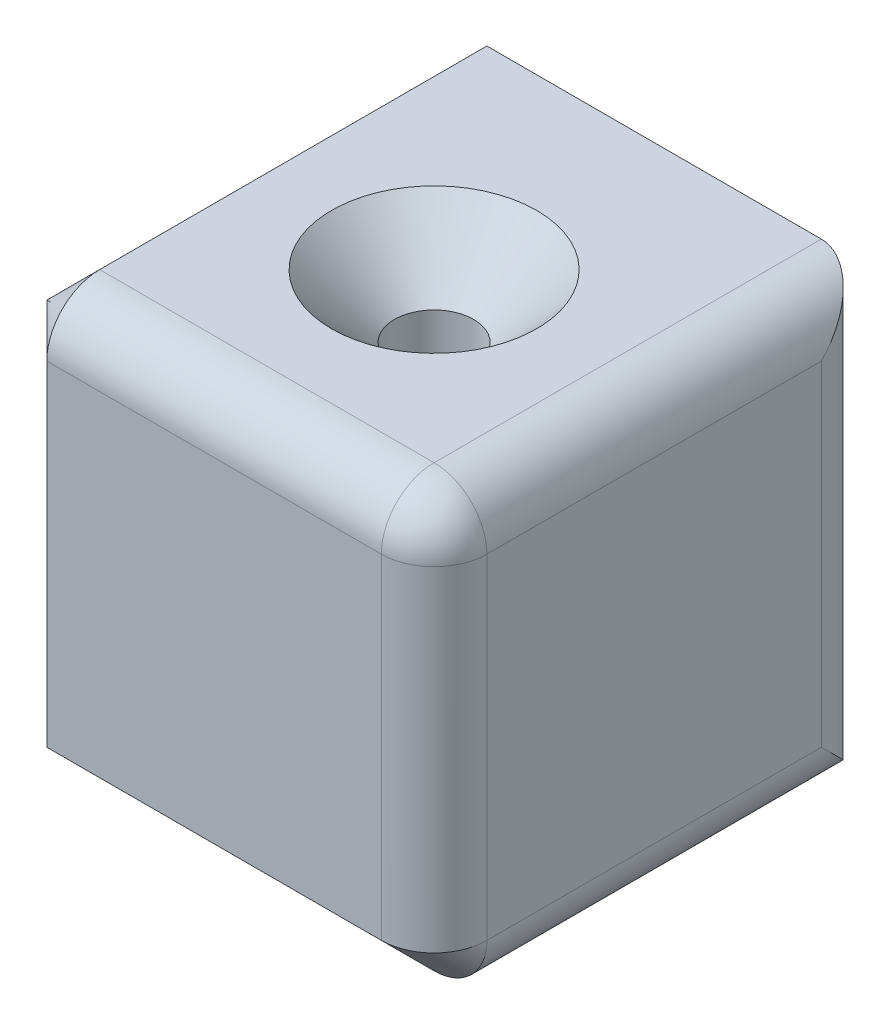
ISO-10303-21;
HEADER;
FILE_DESCRIPTION(('STEP AP214'),'2;1');
FILE_NAME('part.step','',(''),(''),'','','');
FILE_SCHEMA(('AUTOMOTIVE_DESIGN { 1 0 10303 214 1 1 1 1 }'));
ENDSEC;
DATA;
#1=APPLICATION_CONTEXT('core data for automotive mechanical design processes');
#2=APPLICATION_PROTOCOL_DEFINITION('international standard','automotive_design',2000,#1);
#3=PRODUCT_CONTEXT('',#1,'mechanical');
#4=PRODUCT('Part','Part','',(#3));
#5=PRODUCT_RELATED_PRODUCT_CATEGORY('part','',(#4));
#6=PRODUCT_DEFINITION_FORMATION('','',#4);
#7=PRODUCT_DEFINITION_CONTEXT('part definition',#1,'design');
#8=PRODUCT_DEFINITION('design','',#6,#7);
#9=PRODUCT_DEFINITION_SHAPE('','',#8);
#10=(LENGTH_UNIT() NAMED_UNIT(*) SI_UNIT(.MILLI.,.METRE.));
#11=(NAMED_UNIT(*) PLANE_ANGLE_UNIT() SI_UNIT($,.RADIAN.));
#12=(NAMED_UNIT(*) SI_UNIT($,.STERADIAN.) SOLID_ANGLE_UNIT());
#13=UNCERTAINTY_MEASURE_WITH_UNIT(LENGTH_MEASURE(1.E-05),#10,'distance_accuracy_value','');
#14=(GEOMETRIC_REPRESENTATION_CONTEXT(3) GLOBAL_UNCERTAINTY_ASSIGNED_CONTEXT((#13)) GLOBAL_UNIT_ASSIGNED_CONTEXT((#10,
#11,#12)) REPRESENTATION_CONTEXT('',''));
#15=CARTESIAN_POINT('',(0.,0.,0.));
#16=DIRECTION('',(0.,0.,1.));
#17=DIRECTION('',(1.,0.,0.));
#18=AXIS2_PLACEMENT_3D('',#15,#16,#17);
#19=CARTESIAN_POINT('',(0.,0.,25.));
#20=DIRECTION('',(1.,0.,0.));
#21=DIRECTION('',(0.,0.,-1.));
#22=AXIS2_PLACEMENT_3D('',#19,#20,#21);
#23=PLANE('',#22);
#24=DIRECTION('',(0.,1.,0.));
#25=VECTOR('',#24,1.);
#26=CARTESIAN_POINT('',(0.,0.,22.));
#27=LINE('',#26,#25);
#28=CARTESIAN_POINT('',(0.,0.,22.));
#29=VERTEX_POINT('',#28);
#30=CARTESIAN_POINT('',(0.,22.,22.));
#31=VERTEX_POINT('',#30);
#32=EDGE_CURVE('E306',#29,#31,#27,.T.);
#33=ORIENTED_EDGE('',*,*,#32,.T.);
#34=DIRECTION('',(0.,0.,-1.));
#35=VECTOR('',#34,1.);
#36=CARTESIAN_POINT('',(0.,22.,25.));
#37=LINE('',#36,#35);
#38=CARTESIAN_POINT('',(0.,22.,0.));
#39=VERTEX_POINT('',#38);
#40=EDGE_CURVE('E138',#31,#39,#37,.T.);
#41=ORIENTED_EDGE('',*,*,#40,.T.);
#42=DIRECTION('',(0.,-1.,0.));
#43=VECTOR('',#42,1.);
#44=CARTESIAN_POINT('',(0.,0.,0.));
#45=LINE('',#44,#43);
#46=CARTESIAN_POINT('',(0.,0.,0.));
#47=VERTEX_POINT('',#46);
#48=EDGE_CURVE('E136',#39,#47,#45,.T.);
#49=ORIENTED_EDGE('',*,*,#48,.T.);
#50=DIRECTION('',(0.,0.,-1.));
#51=VECTOR('',#50,1.);
#52=CARTESIAN_POINT('',(0.,0.,25.));
#53=LINE('',#52,#51);
#54=EDGE_CURVE('E120',#29,#47,#53,.T.);
#55=ORIENTED_EDGE('',*,*,#54,.F.);
#56=EDGE_LOOP('',(#33,#41,#49,#55));
#57=FACE_BOUND('',#56,.T.);
#58=ADVANCED_FACE('F46',(#57),#23,.F.);
#59=CARTESIAN_POINT('',(0.,0.,25.));
#60=DIRECTION('',(0.,1.,0.));
#61=DIRECTION('',(0.,0.,1.));
#62=AXIS2_PLACEMENT_3D('',#59,#60,#61);
#63=PLANE('',#62);
#64=CARTESIAN_POINT('',(12.5,0.,12.5));
#65=DIRECTION('',(0.,1.,0.));
#66=DIRECTION('',(0.,0.,1.));
#67=AXIS2_PLACEMENT_3D('',#64,#65,#66);
#68=CIRCLE('',#67,2.25);
#69=CARTESIAN_POINT('',(12.5,0.,14.75));
#70=VERTEX_POINT('',#69);
#71=EDGE_CURVE('E313',#70,#70,#68,.T.);
#72=ORIENTED_EDGE('',*,*,#71,.T.);
#73=EDGE_LOOP('',(#72));
#74=FACE_BOUND('',#73,.T.);
#75=DIRECTION('',(0.,0.,-1.));
#76=VECTOR('',#75,1.);
#77=CARTESIAN_POINT('',(22.,0.,25.));
#78=LINE('',#77,#76);
#79=CARTESIAN_POINT('',(22.,0.,0.));
#80=VERTEX_POINT('',#79);
#81=CARTESIAN_POINT('',(22.,0.,22.));
#82=VERTEX_POINT('',#81);
#83=EDGE_CURVE('E165',#80,#82,#78,.F.);
#84=ORIENTED_EDGE('',*,*,#83,.T.);
#85=DIRECTION('',(-1.,0.,0.));
#86=VECTOR('',#85,1.);
#87=CARTESIAN_POINT('',(0.,0.,22.));
#88=LINE('',#87,#86);
#89=EDGE_CURVE('E11',#82,#29,#88,.T.);
#90=ORIENTED_EDGE('',*,*,#89,.T.);
#91=ORIENTED_EDGE('',*,*,#54,.T.);
#92=DIRECTION('',(1.,0.,0.));
#93=VECTOR('',#92,1.);
#94=CARTESIAN_POINT('',(0.,0.,0.));
#95=LINE('',#94,#93);
#96=EDGE_CURVE('E125',#47,#80,#95,.T.);
#97=ORIENTED_EDGE('',*,*,#96,.T.);
#98=EDGE_LOOP('',(#84,#90,#91,#97));
#99=FACE_BOUND('',#98,.T.);
#100=ADVANCED_FACE('F123',(#74,#99),#63,.F.);
#101=CARTESIAN_POINT('',(25.,0.,25.));
#102=DIRECTION('',(-1.,0.,0.));
#103=DIRECTION('',(0.,0.,1.));
#104=AXIS2_PLACEMENT_3D('',#101,#102,#103);
#105=PLANE('',#104);
#106=DIRECTION('',(0.,1.,0.));
#107=VECTOR('',#106,1.);
#108=CARTESIAN_POINT('',(25.,0.,22.));
#109=LINE('',#108,#107);
#110=CARTESIAN_POINT('',(25.,22.,22.));
#111=VERTEX_POINT('',#110);
#112=CARTESIAN_POINT('',(25.,3.,22.));
#113=VERTEX_POINT('',#112);
#114=EDGE_CURVE('E159',#111,#113,#109,.F.);
#115=ORIENTED_EDGE('',*,*,#114,.T.);
#116=DIRECTION('',(0.,0.,-1.));
#117=VECTOR('',#116,1.);
#118=CARTESIAN_POINT('',(25.,3.,25.));
#119=LINE('',#118,#117);
#120=CARTESIAN_POINT('',(25.,3.,3.));
#121=VERTEX_POINT('',#120);
#122=EDGE_CURVE('E169',#113,#121,#119,.T.);
#123=ORIENTED_EDGE('',*,*,#122,.T.);
#124=DIRECTION('',(0.,1.,0.));
#125=VECTOR('',#124,1.);
#126=CARTESIAN_POINT('',(25.,25.,3.));
#127=LINE('',#126,#125);
#128=CARTESIAN_POINT('',(25.,22.,3.));
#129=VERTEX_POINT('',#128);
#130=EDGE_CURVE('E131',#121,#129,#127,.T.);
#131=ORIENTED_EDGE('',*,*,#130,.T.);
#132=DIRECTION('',(0.,0.,-1.));
#133=VECTOR('',#132,1.);
#134=CARTESIAN_POINT('',(25.,22.,25.));
#135=LINE('',#134,#133);
#136=EDGE_CURVE('E156',#129,#111,#135,.F.);
#137=ORIENTED_EDGE('',*,*,#136,.T.);
#138=EDGE_LOOP('',(#115,#123,#131,#137));
#139=FACE_BOUND('',#138,.T.);
#140=ADVANCED_FACE('F347',(#139),#105,.F.);
#141=CARTESIAN_POINT('',(0.,25.,25.));
#142=DIRECTION('',(0.,-1.,0.));
#143=DIRECTION('',(0.,0.,-1.));
#144=AXIS2_PLACEMENT_3D('',#141,#142,#143);
#145=PLANE('',#144);
#146=CARTESIAN_POINT('',(12.5,25.,12.5));
#147=DIRECTION('',(0.,1.,0.));
#148=DIRECTION('',(0.,0.,1.));
#149=AXIS2_PLACEMENT_3D('',#146,#147,#148);
#150=CIRCLE('',#149,5.82633873679264);
#151=CARTESIAN_POINT('',(12.5,25.,18.3263387367926));
#152=VERTEX_POINT('',#151);
#153=EDGE_CURVE('E141',#152,#152,#150,.T.);
#154=ORIENTED_EDGE('',*,*,#153,.F.);
#155=EDGE_LOOP('',(#154));
#156=FACE_BOUND('',#155,.T.);
#157=DIRECTION('',(-1.,0.,0.));
#158=VECTOR('',#157,1.);
#159=CARTESIAN_POINT('',(0.,25.,0.));
#160=LINE('',#159,#158);
#161=CARTESIAN_POINT('',(22.,25.,0.));
#162=VERTEX_POINT('',#161);
#163=CARTESIAN_POINT('',(3.00000000000001,25.,0.));
#164=VERTEX_POINT('',#163);
#165=EDGE_CURVE('E132',#162,#164,#160,.T.);
#166=ORIENTED_EDGE('',*,*,#165,.T.);
#167=DIRECTION('',(0.,0.,1.));
#168=VECTOR('',#167,1.);
#169=CARTESIAN_POINT('',(3.00000000000001,25.,25.));
#170=LINE('',#169,#168);
#171=CARTESIAN_POINT('',(3.00000000000001,25.,22.));
#172=VERTEX_POINT('',#171);
#173=EDGE_CURVE('E292',#164,#172,#170,.T.);
#174=ORIENTED_EDGE('',*,*,#173,.T.);
#175=DIRECTION('',(-1.,0.,0.));
#176=VECTOR('',#175,1.);
#177=CARTESIAN_POINT('',(0.,25.,22.));
#178=LINE('',#177,#176);
#179=CARTESIAN_POINT('',(22.,25.,22.));
#180=VERTEX_POINT('',#179);
#181=EDGE_CURVE('E334',#172,#180,#178,.F.);
#182=ORIENTED_EDGE('',*,*,#181,.T.);
#183=DIRECTION('',(0.,0.,-1.));
#184=VECTOR('',#183,1.);
#185=CARTESIAN_POINT('',(22.,25.,25.));
#186=LINE('',#185,#184);
#187=EDGE_CURVE('E331',#180,#162,#186,.T.);
#188=ORIENTED_EDGE('',*,*,#187,.T.);
#189=EDGE_LOOP('',(#166,#174,#182,#188));
#190=FACE_BOUND('',#189,.T.);
#191=ADVANCED_FACE('F368',(#156,#190),#145,.F.);
#192=CARTESIAN_POINT('',(0.,0.,25.));
#193=DIRECTION('',(0.,0.,-1.));
#194=DIRECTION('',(-1.,0.,0.));
#195=AXIS2_PLACEMENT_3D('',#192,#193,#194);
#196=PLANE('',#195);
#197=DIRECTION('',(-1.,0.,0.));
#198=VECTOR('',#197,1.);
#199=CARTESIAN_POINT('',(0.,22.,25.));
#200=LINE('',#199,#198);
#201=CARTESIAN_POINT('',(22.,22.,25.));
#202=VERTEX_POINT('',#201);
#203=CARTESIAN_POINT('',(3.00000000000001,22.,25.));
#204=VERTEX_POINT('',#203);
#205=EDGE_CURVE('E162',#202,#204,#200,.T.);
#206=ORIENTED_EDGE('',*,*,#205,.T.);
#207=DIRECTION('',(0.,-1.,0.));
#208=VECTOR('',#207,1.);
#209=CARTESIAN_POINT('',(3.00000000000001,0.,25.));
#210=LINE('',#209,#208);
#211=CARTESIAN_POINT('',(3.00000000000001,3.00000000000001,25.));
#212=VERTEX_POINT('',#211);
#213=EDGE_CURVE('E59',#204,#212,#210,.T.);
#214=ORIENTED_EDGE('',*,*,#213,.T.);
#215=DIRECTION('',(1.,0.,0.));
#216=VECTOR('',#215,1.);
#217=CARTESIAN_POINT('',(0.,3.00000000000001,25.));
#218=LINE('',#217,#216);
#219=CARTESIAN_POINT('',(22.,3.00000000000001,25.));
#220=VERTEX_POINT('',#219);
#221=EDGE_CURVE('E70',#212,#220,#218,.T.);
#222=ORIENTED_EDGE('',*,*,#221,.T.);
#223=DIRECTION('',(0.,1.,0.));
#224=VECTOR('',#223,1.);
#225=CARTESIAN_POINT('',(22.,0.,25.));
#226=LINE('',#225,#224);
#227=EDGE_CURVE('E336',#220,#202,#226,.T.);
#228=ORIENTED_EDGE('',*,*,#227,.T.);
#229=EDGE_LOOP('',(#206,#214,#222,#228));
#230=FACE_BOUND('',#229,.T.);
#231=ADVANCED_FACE('F359',(#230),#196,.F.);
#232=CARTESIAN_POINT('',(0.,0.,0.));
#233=DIRECTION('',(0.,0.,-1.));
#234=DIRECTION('',(-1.,0.,0.));
#235=AXIS2_PLACEMENT_3D('',#232,#233,#234);
#236=PLANE('',#235);
#237=ORIENTED_EDGE('',*,*,#48,.F.);
#238=DIRECTION('',(-0.707106781186548,-0.707106781186548,0.));
#239=VECTOR('',#238,1.);
#240=CARTESIAN_POINT('',(-11.,11.,0.));
#241=LINE('',#240,#239);
#242=EDGE_CURVE('E298',#39,#164,#241,.F.);
#243=ORIENTED_EDGE('',*,*,#242,.T.);
#244=ORIENTED_EDGE('',*,*,#165,.F.);
#245=DIRECTION('',(0.,1.,0.));
#246=VECTOR('',#245,1.);
#247=CARTESIAN_POINT('',(22.,0.,0.));
#248=LINE('',#247,#246);
#249=EDGE_CURVE('E146',#162,#80,#248,.F.);
#250=ORIENTED_EDGE('',*,*,#249,.T.);
#251=ORIENTED_EDGE('',*,*,#96,.F.);
#252=EDGE_LOOP('',(#237,#243,#244,#250,#251));
#253=FACE_BOUND('',#252,.T.);
#254=ADVANCED_FACE('F143',(#253),#236,.T.);
#255=CARTESIAN_POINT('',(12.5,25.,12.5));
#256=DIRECTION('',(0.,1.,0.));
#257=DIRECTION('',(0.,0.,1.));
#258=AXIS2_PLACEMENT_3D('',#255,#256,#257);
#259=CONICAL_SURFACE('',#258,5.82633873679264,0.785398163397443);
#260=CARTESIAN_POINT('',(12.5,21.4236612632073,12.5));
#261=DIRECTION('',(0.,1.,0.));
#262=DIRECTION('',(0.,0.,1.));
#263=AXIS2_PLACEMENT_3D('',#260,#261,#262);
#264=CIRCLE('',#263,2.25);
#265=CARTESIAN_POINT('',(12.5,21.4236612632073,14.75));
#266=VERTEX_POINT('',#265);
#267=EDGE_CURVE('E392',#266,#266,#264,.T.);
#268=ORIENTED_EDGE('',*,*,#267,.F.);
#269=EDGE_LOOP('',(#268));
#270=FACE_BOUND('',#269,.T.);
#271=ORIENTED_EDGE('',*,*,#153,.T.);
#272=EDGE_LOOP('',(#271));
#273=FACE_BOUND('',#272,.T.);
#274=ADVANCED_FACE('F400',(#270,#273),#259,.F.);
#275=CARTESIAN_POINT('',(12.5,25.,12.5));
#276=DIRECTION('',(0.,1.,0.));
#277=DIRECTION('',(0.,0.,1.));
#278=AXIS2_PLACEMENT_3D('',#275,#276,#277);
#279=CYLINDRICAL_SURFACE('',#278,2.25);
#280=ORIENTED_EDGE('',*,*,#71,.F.);
#281=EDGE_LOOP('',(#280));
#282=FACE_BOUND('',#281,.T.);
#283=ORIENTED_EDGE('',*,*,#267,.T.);
#284=EDGE_LOOP('',(#283));
#285=FACE_BOUND('',#284,.T.);
#286=ADVANCED_FACE('F402',(#282,#285),#279,.F.);
#287=CARTESIAN_POINT('',(0.,22.,22.));
#288=DIRECTION('',(-1.,0.,0.));
#289=DIRECTION('',(0.,0.,1.));
#290=AXIS2_PLACEMENT_3D('',#287,#288,#289);
#291=CYLINDRICAL_SURFACE('',#290,3.);
#292=ORIENTED_EDGE('',*,*,#181,.F.);
#293=CARTESIAN_POINT('',(3.00000000000001,22.,22.));
#294=DIRECTION('',(1.,0.,0.));
#295=DIRECTION('',(0.,0.,-1.));
#296=AXIS2_PLACEMENT_3D('',#293,#294,#295);
#297=CIRCLE('',#296,3.);
#298=EDGE_CURVE('E170',#172,#204,#297,.T.);
#299=ORIENTED_EDGE('',*,*,#298,.T.);
#300=ORIENTED_EDGE('',*,*,#205,.F.);
#301=CARTESIAN_POINT('',(22.,22.,22.));
#302=DIRECTION('',(1.,0.,0.));
#303=DIRECTION('',(0.,0.,-1.));
#304=AXIS2_PLACEMENT_3D('',#301,#302,#303);
#305=CIRCLE('',#304,3.);
#306=EDGE_CURVE('E309',#180,#202,#305,.T.);
#307=ORIENTED_EDGE('',*,*,#306,.F.);
#308=EDGE_LOOP('',(#292,#299,#300,#307));
#309=FACE_BOUND('',#308,.T.);
#310=ADVANCED_FACE('F360',(#309),#291,.T.);
#311=CARTESIAN_POINT('',(22.,22.,22.));
#312=DIRECTION('',(0.,1.,0.));
#313=DIRECTION('',(0.,0.,1.));
#314=AXIS2_PLACEMENT_3D('',#311,#312,#313);
#315=SPHERICAL_SURFACE('',#314,3.);
#316=CARTESIAN_POINT('',(22.,22.,22.));
#317=DIRECTION('',(0.,1.,0.));
#318=DIRECTION('',(0.,0.,1.));
#319=AXIS2_PLACEMENT_3D('',#316,#317,#318);
#320=CIRCLE('',#319,3.);
#321=EDGE_CURVE('E318',#111,#202,#320,.F.);
#322=ORIENTED_EDGE('',*,*,#321,.F.);
#323=CARTESIAN_POINT('',(22.,22.,22.));
#324=DIRECTION('',(0.,0.,1.));
#325=DIRECTION('',(1.,0.,0.));
#326=AXIS2_PLACEMENT_3D('',#323,#324,#325);
#327=CIRCLE('',#326,3.);
#328=EDGE_CURVE('E314',#180,#111,#327,.F.);
#329=ORIENTED_EDGE('',*,*,#328,.F.);
#330=ORIENTED_EDGE('',*,*,#306,.T.);
#331=EDGE_LOOP('',(#322,#329,#330));
#332=FACE_BOUND('',#331,.T.);
#333=ADVANCED_FACE('F357',(#332),#315,.T.);
#334=CARTESIAN_POINT('',(22.,22.,25.));
#335=DIRECTION('',(0.,0.,-1.));
#336=DIRECTION('',(-1.,0.,0.));
#337=AXIS2_PLACEMENT_3D('',#334,#335,#336);
#338=CYLINDRICAL_SURFACE('',#337,3.);
#339=ORIENTED_EDGE('',*,*,#328,.T.);
#340=ORIENTED_EDGE('',*,*,#136,.F.);
#341=CARTESIAN_POINT('',(22.,22.,3.));
#342=DIRECTION('',(0.,-0.707106781186547,-0.707106781186547));
#343=DIRECTION('',(0.,-0.707106781186547,0.707106781186547));
#344=AXIS2_PLACEMENT_3D('',#341,#342,#343);
#345=ELLIPSE('',#344,4.24264068711928,3.);
#346=EDGE_CURVE('E322',#162,#129,#345,.T.);
#347=ORIENTED_EDGE('',*,*,#346,.F.);
#348=ORIENTED_EDGE('',*,*,#187,.F.);
#349=EDGE_LOOP('',(#339,#340,#347,#348));
#350=FACE_BOUND('',#349,.T.);
#351=ADVANCED_FACE('F202',(#350),#338,.T.);
#352=CARTESIAN_POINT('',(22.,0.,22.));
#353=DIRECTION('',(0.,1.,0.));
#354=DIRECTION('',(0.,0.,1.));
#355=AXIS2_PLACEMENT_3D('',#352,#353,#354);
#356=CYLINDRICAL_SURFACE('',#355,3.);
#357=ORIENTED_EDGE('',*,*,#227,.F.);
#358=CARTESIAN_POINT('',(25.,3.,22.));
#359=CARTESIAN_POINT('',(25.,3.,22.2778977561766));
#360=CARTESIAN_POINT('',(24.9603489607797,3.,22.554878178305));
#361=CARTESIAN_POINT('',(24.815474528059,3.,23.0698873511729));
#362=CARTESIAN_POINT('',(24.7109932523984,3.,23.3073564895324));
#363=CARTESIAN_POINT('',(24.4661440043677,3.,23.7253403012141));
#364=CARTESIAN_POINT('',(24.3262255694513,3.,23.9062260862826));
#365=CARTESIAN_POINT('',(24.0347585257967,3.,24.2146740242508));
#366=CARTESIAN_POINT('',(23.883200754588,3.,24.34261059027));
#367=CARTESIAN_POINT('',(23.5809008605497,3.,24.5563688952964));
#368=CARTESIAN_POINT('',(23.4300193540044,3.,24.6423472302576));
#369=CARTESIAN_POINT('',(23.1331336914065,3.,24.7826178816856));
#370=CARTESIAN_POINT('',(22.9870236855326,3.,24.8369397553792));
#371=CARTESIAN_POINT('',(22.5557143683683,3.,24.9632673295877));
#372=CARTESIAN_POINT('',(22.2775127693529,3.,25.));
#373=CARTESIAN_POINT('',(22.,3.,25.));
#374=B_SPLINE_CURVE_WITH_KNOTS('',3,(#358,#359,#360,#361,#362,#363,#364,#365,#366,#367,#368,
#369,#370,#371,#372,#373),.UNSPECIFIED.,.F.,.F.,(4,2,2,2,2,2,2,4),(1.5707963267949,
1.76714586764426,1.96349540849362,2.15984494934298,2.35619449019235,2.55254403104171,
2.74889357189107,3.14159265358979),.UNSPECIFIED.);
#375=EDGE_CURVE('E218',#220,#113,#374,.F.);
#376=ORIENTED_EDGE('',*,*,#375,.T.);
#377=ORIENTED_EDGE('',*,*,#114,.F.);
#378=ORIENTED_EDGE('',*,*,#321,.T.);
#379=EDGE_LOOP('',(#357,#376,#377,#378));
#380=FACE_BOUND('',#379,.T.);
#381=ADVANCED_FACE('F197',(#380),#356,.T.);
#382=CARTESIAN_POINT('',(22.,0.,3.));
#383=DIRECTION('',(0.,-1.,0.));
#384=DIRECTION('',(0.,0.,-1.));
#385=AXIS2_PLACEMENT_3D('',#382,#383,#384);
#386=CYLINDRICAL_SURFACE('',#385,3.);
#387=ORIENTED_EDGE('',*,*,#346,.T.);
#388=ORIENTED_EDGE('',*,*,#130,.F.);
#389=CARTESIAN_POINT('',(22.,3.,3.));
#390=DIRECTION('',(0.,-0.707106781186547,0.707106781186547));
#391=DIRECTION('',(0.,-0.707106781186547,-0.707106781186547));
#392=AXIS2_PLACEMENT_3D('',#389,#390,#391);
#393=ELLIPSE('',#392,4.24264068711928,3.);
#394=EDGE_CURVE('E326',#80,#121,#393,.T.);
#395=ORIENTED_EDGE('',*,*,#394,.F.);
#396=ORIENTED_EDGE('',*,*,#249,.F.);
#397=EDGE_LOOP('',(#387,#388,#395,#396));
#398=FACE_BOUND('',#397,.T.);
#399=ADVANCED_FACE('F193',(#398),#386,.T.);
#400=CARTESIAN_POINT('',(22.,3.,25.));
#401=DIRECTION('',(0.,0.,-1.));
#402=DIRECTION('',(-1.,0.,0.));
#403=AXIS2_PLACEMENT_3D('',#400,#401,#402);
#404=CYLINDRICAL_SURFACE('',#403,3.);
#405=ORIENTED_EDGE('',*,*,#122,.F.);
#406=CARTESIAN_POINT('',(22.,0.,22.));
#407=CARTESIAN_POINT('',(22.2775127693524,0.,22.));
#408=CARTESIAN_POINT('',(22.555714368369,0.0367326704125492,22.));
#409=CARTESIAN_POINT('',(22.9870236855322,0.163060244620709,22.));
#410=CARTESIAN_POINT('',(23.1331336914065,0.217382118314373,22.));
#411=CARTESIAN_POINT('',(23.4300193540044,0.357652769742398,22.));
#412=CARTESIAN_POINT('',(23.5809008605494,0.443631104703368,22.));
#413=CARTESIAN_POINT('',(23.8832007545883,0.657389409730261,22.));
#414=CARTESIAN_POINT('',(24.0347585257966,0.785325975749095,22.));
#415=CARTESIAN_POINT('',(24.3262255694515,1.09377391371752,22.));
#416=CARTESIAN_POINT('',(24.4661440043678,1.2746596987861,22.));
#417=CARTESIAN_POINT('',(24.7109932523983,1.69264351046735,22.));
#418=CARTESIAN_POINT('',(24.8154745280589,1.93011264882701,22.));
#419=CARTESIAN_POINT('',(24.9603489607798,2.44512182169513,22.));
#420=CARTESIAN_POINT('',(25.,2.72210224382335,22.));
#421=CARTESIAN_POINT('',(25.,2.99999999999999,22.));
#422=B_SPLINE_CURVE_WITH_KNOTS('',3,(#406,#407,#408,#409,#410,#411,#412,#413,#414,#415,#416,
#417,#418,#419,#420,#421),.UNSPECIFIED.,.F.,.F.,(4,2,2,2,2,2,2,4),(1.5707963267949,
1.96349540849362,2.15984494934298,2.35619449019235,2.55254403104171,2.74889357189107,
2.94524311274043,3.14159265358979),.UNSPECIFIED.);
#423=EDGE_CURVE('E176',#113,#82,#422,.F.);
#424=ORIENTED_EDGE('',*,*,#423,.T.);
#425=ORIENTED_EDGE('',*,*,#83,.F.);
#426=ORIENTED_EDGE('',*,*,#394,.T.);
#427=EDGE_LOOP('',(#405,#424,#425,#426));
#428=FACE_BOUND('',#427,.T.);
#429=ADVANCED_FACE('F182',(#428),#404,.T.);
#430=CARTESIAN_POINT('',(25.,2.99999999999999,22.));
#431=CARTESIAN_POINT('',(25.,2.72210224382335,22.));
#432=CARTESIAN_POINT('',(24.9603489607798,2.44512182169513,22.));
#433=CARTESIAN_POINT('',(24.8154745280589,1.93011264882701,22.));
#434=CARTESIAN_POINT('',(24.7109932523983,1.69264351046735,22.));
#435=CARTESIAN_POINT('',(24.4661440043678,1.2746596987861,22.));
#436=CARTESIAN_POINT('',(24.3262255694515,1.09377391371752,22.));
#437=CARTESIAN_POINT('',(24.0347585257966,0.785325975749095,22.));
#438=CARTESIAN_POINT('',(23.8832007545883,0.657389409730261,22.));
#439=CARTESIAN_POINT('',(23.5809008605494,0.443631104703368,22.));
#440=CARTESIAN_POINT('',(23.4300193540044,0.357652769742398,22.));
#441=CARTESIAN_POINT('',(23.1331336914065,0.217382118314373,22.));
#442=CARTESIAN_POINT('',(22.9870236855322,0.163060244620709,22.));
#443=CARTESIAN_POINT('',(22.555714368369,0.0367326704125492,22.));
#444=CARTESIAN_POINT('',(22.2775127693524,0.,22.));
#445=CARTESIAN_POINT('',(22.,0.,22.));
#446=CARTESIAN_POINT('',(25.,3.,22.));
#447=CARTESIAN_POINT('',(25.,3.,22.2778977561766));
#448=CARTESIAN_POINT('',(24.9603489607797,3.,22.554878178305));
#449=CARTESIAN_POINT('',(24.815474528059,3.,23.0698873511729));
#450=CARTESIAN_POINT('',(24.7109932523984,3.,23.3073564895324));
#451=CARTESIAN_POINT('',(24.4661440043677,3.,23.7253403012141));
#452=CARTESIAN_POINT('',(24.3262255694513,3.,23.9062260862826));
#453=CARTESIAN_POINT('',(24.0347585257967,3.,24.2146740242508));
#454=CARTESIAN_POINT('',(23.883200754588,3.,24.34261059027));
#455=CARTESIAN_POINT('',(23.5809008605497,3.,24.5563688952964));
#456=CARTESIAN_POINT('',(23.4300193540044,3.,24.6423472302576));
#457=CARTESIAN_POINT('',(23.1331336914065,3.,24.7826178816856));
#458=CARTESIAN_POINT('',(22.9870236855326,3.,24.8369397553792));
#459=CARTESIAN_POINT('',(22.5557143683683,3.,24.9632673295877));
#460=CARTESIAN_POINT('',(22.2775127693529,3.,25.));
#461=CARTESIAN_POINT('',(22.,3.,25.));
#462=B_SPLINE_SURFACE_WITH_KNOTS('',1,3,((#430,#431,#432,#433,#434,#435,#436,#437,#438,#439,
#440,#441,#442,#443,#444,#445),(#446,#447,#448,#449,#450,#451,#452,#453,#454,#455,#456,#457,
#458,#459,#460,#461)),.UNSPECIFIED.,.F.,.F.,.F.,(2,2),(4,2,2,2,2,2,2,4),(0.,1.),
(1.5707963267949,1.76714586764426,1.96349540849362,2.15984494934298,2.35619449019235,
2.55254403104171,2.74889357189107,3.14159265358979),.UNSPECIFIED.);
#463=CARTESIAN_POINT('',(22.,3.,25.));
#464=CARTESIAN_POINT('',(22.,0.,22.));
#465=B_SPLINE_CURVE_WITH_KNOTS('',1,(#463,#464),.UNSPECIFIED.,.F.,.F.,(2,2),(0.,1.),.UNSPECIFIED.);
#466=EDGE_CURVE('E237',#82,#220,#465,.F.);
#467=ORIENTED_EDGE('',*,*,#423,.F.);
#468=ORIENTED_EDGE('',*,*,#375,.F.);
#469=ORIENTED_EDGE('',*,*,#466,.F.);
#470=EDGE_LOOP('',(#467,#468,#469));
#471=FACE_BOUND('',#470,.T.);
#472=ADVANCED_FACE('F192',(#471),#462,.T.);
#473=CARTESIAN_POINT('',(0.,3.00000000000001,25.));
#474=DIRECTION('',(0.,0.707106781186547,-0.707106781186547));
#475=DIRECTION('',(1.,0.,0.));
#476=AXIS2_PLACEMENT_3D('',#473,#474,#475);
#477=PLANE('',#476);
#478=ORIENTED_EDGE('',*,*,#466,.T.);
#479=ORIENTED_EDGE('',*,*,#221,.F.);
#480=DIRECTION('',(-0.577350269189626,-0.577350269189626,-0.577350269189626));
#481=VECTOR('',#480,1.);
#482=CARTESIAN_POINT('',(2.00000000000001,2.00000000000001,24.));
#483=LINE('',#482,#481);
#484=EDGE_CURVE('E233',#29,#212,#483,.F.);
#485=ORIENTED_EDGE('',*,*,#484,.F.);
#486=ORIENTED_EDGE('',*,*,#89,.F.);
#487=EDGE_LOOP('',(#478,#479,#485,#486));
#488=FACE_BOUND('',#487,.T.);
#489=ADVANCED_FACE('F49',(#488),#477,.F.);
#490=CARTESIAN_POINT('',(3.00000000000001,0.,25.));
#491=DIRECTION('',(0.707106781186547,0.,-0.707106781186547));
#492=DIRECTION('',(0.,-1.,0.));
#493=AXIS2_PLACEMENT_3D('',#490,#491,#492);
#494=PLANE('',#493);
#495=ORIENTED_EDGE('',*,*,#484,.T.);
#496=ORIENTED_EDGE('',*,*,#213,.F.);
#497=DIRECTION('',(0.707106781186547,0.,0.707106781186547));
#498=VECTOR('',#497,1.);
#499=CARTESIAN_POINT('',(0.,22.,22.));
#500=LINE('',#499,#498);
#501=EDGE_CURVE('E229',#31,#204,#500,.T.);
#502=ORIENTED_EDGE('',*,*,#501,.F.);
#503=ORIENTED_EDGE('',*,*,#32,.F.);
#504=EDGE_LOOP('',(#495,#496,#502,#503));
#505=FACE_BOUND('',#504,.T.);
#506=ADVANCED_FACE('F271',(#505),#494,.F.);
#507=CARTESIAN_POINT('',(3.00000000000001,22.,22.));
#508=DIRECTION('',(1.,0.,0.));
#509=DIRECTION('',(0.,0.,-1.));
#510=AXIS2_PLACEMENT_3D('',#507,#508,#509);
#511=CONICAL_SURFACE('',#510,3.00000000000001,0.785398163397448);
#512=ORIENTED_EDGE('',*,*,#501,.T.);
#513=ORIENTED_EDGE('',*,*,#298,.F.);
#514=DIRECTION('',(0.707106781186547,0.707106781186547,0.));
#515=VECTOR('',#514,1.);
#516=CARTESIAN_POINT('',(0.,22.,22.));
#517=LINE('',#516,#515);
#518=EDGE_CURVE('E225',#31,#172,#517,.T.);
#519=ORIENTED_EDGE('',*,*,#518,.F.);
#520=EDGE_LOOP('',(#512,#513,#519));
#521=FACE_BOUND('',#520,.T.);
#522=ADVANCED_FACE('F364',(#521),#511,.T.);
#523=CARTESIAN_POINT('',(0.,22.,25.));
#524=DIRECTION('',(0.707106781186547,-0.707106781186547,0.));
#525=DIRECTION('',(0.,0.,-1.));
#526=AXIS2_PLACEMENT_3D('',#523,#524,#525);
#527=PLANE('',#526);
#528=ORIENTED_EDGE('',*,*,#518,.T.);
#529=ORIENTED_EDGE('',*,*,#173,.F.);
#530=ORIENTED_EDGE('',*,*,#242,.F.);
#531=ORIENTED_EDGE('',*,*,#40,.F.);
#532=EDGE_LOOP('',(#528,#529,#530,#531));
#533=FACE_BOUND('',#532,.T.);
#534=ADVANCED_FACE('F367',(#533),#527,.F.);
#535=CLOSED_SHELL('',(#58,#100,#140,#191,#231,#254,#274,#286,#310,#333,#351,#381,#399,#429,#472,
#489,#506,#522,#534));
#536=MANIFOLD_SOLID_BREP('B2',#535);
#537=ADVANCED_BREP_SHAPE_REPRESENTATION('',(#18,#536),#14);
#538=SHAPE_DEFINITION_REPRESENTATION(#9,#537);
ENDSEC;
END-ISO-10303-21;
